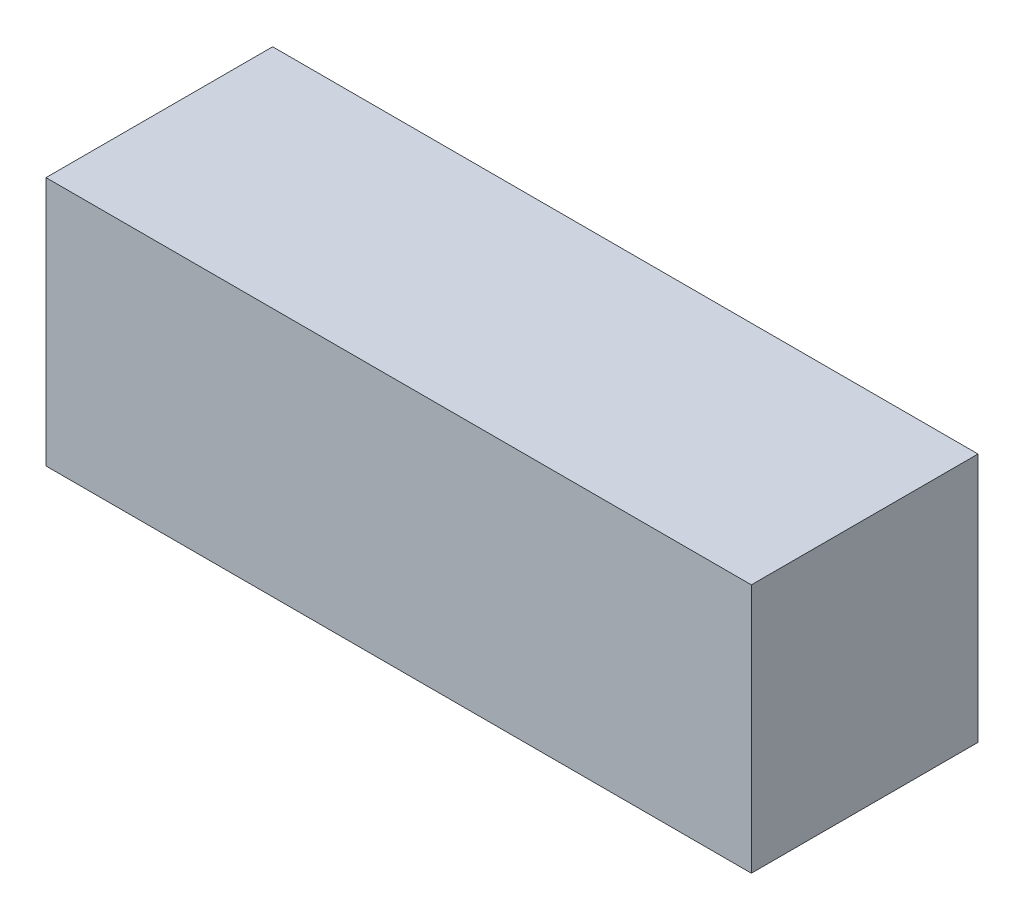
ISO-10303-21;
HEADER;
FILE_DESCRIPTION(('STEP AP214'),'2;1');
FILE_NAME('part.step','',(''),(''),'','','');
FILE_SCHEMA(('AUTOMOTIVE_DESIGN { 1 0 10303 214 1 1 1 1 }'));
ENDSEC;
DATA;
#1=APPLICATION_CONTEXT('core data for automotive mechanical design processes');
#2=APPLICATION_PROTOCOL_DEFINITION('international standard','automotive_design',2000,#1);
#3=PRODUCT_CONTEXT('',#1,'mechanical');
#4=PRODUCT('Part','Part','',(#3));
#5=PRODUCT_RELATED_PRODUCT_CATEGORY('part','',(#4));
#6=PRODUCT_DEFINITION_FORMATION('','',#4);
#7=PRODUCT_DEFINITION_CONTEXT('part definition',#1,'design');
#8=PRODUCT_DEFINITION('design','',#6,#7);
#9=PRODUCT_DEFINITION_SHAPE('','',#8);
#10=(LENGTH_UNIT() NAMED_UNIT(*) SI_UNIT(.MILLI.,.METRE.));
#11=(NAMED_UNIT(*) PLANE_ANGLE_UNIT() SI_UNIT($,.RADIAN.));
#12=(NAMED_UNIT(*) SI_UNIT($,.STERADIAN.) SOLID_ANGLE_UNIT());
#13=UNCERTAINTY_MEASURE_WITH_UNIT(LENGTH_MEASURE(1.E-05),#10,'distance_accuracy_value','');
#14=(GEOMETRIC_REPRESENTATION_CONTEXT(3) GLOBAL_UNCERTAINTY_ASSIGNED_CONTEXT((#13)) GLOBAL_UNIT_ASSIGNED_CONTEXT((#10,
#11,#12)) REPRESENTATION_CONTEXT('',''));
#15=CARTESIAN_POINT('',(0.,0.,0.));
#16=DIRECTION('',(0.,0.,1.));
#17=DIRECTION('',(1.,0.,0.));
#18=AXIS2_PLACEMENT_3D('',#15,#16,#17);
#19=CARTESIAN_POINT('',(0.,54.864,0.));
#20=DIRECTION('',(1.,0.,0.));
#21=DIRECTION('',(0.,0.,-1.));
#22=AXIS2_PLACEMENT_3D('',#19,#20,#21);
#23=PLANE('',#22);
#24=DIRECTION('',(0.,0.,1.));
#25=VECTOR('',#24,1.);
#26=CARTESIAN_POINT('',(0.,0.,0.));
#27=LINE('',#26,#25);
#28=CARTESIAN_POINT('',(0.,0.,-49.784));
#29=VERTEX_POINT('',#28);
#30=CARTESIAN_POINT('',(0.,0.,0.));
#31=VERTEX_POINT('',#30);
#32=EDGE_CURVE('E100',#29,#31,#27,.T.);
#33=ORIENTED_EDGE('',*,*,#32,.T.);
#34=DIRECTION('',(0.,-1.,0.));
#35=VECTOR('',#34,1.);
#36=CARTESIAN_POINT('',(0.,54.864,0.));
#37=LINE('',#36,#35);
#38=CARTESIAN_POINT('',(0.,54.864,0.));
#39=VERTEX_POINT('',#38);
#40=EDGE_CURVE('E11',#39,#31,#37,.T.);
#41=ORIENTED_EDGE('',*,*,#40,.F.);
#42=DIRECTION('',(0.,0.,1.));
#43=VECTOR('',#42,1.);
#44=CARTESIAN_POINT('',(0.,54.864,0.));
#45=LINE('',#44,#43);
#46=CARTESIAN_POINT('',(0.,54.864,-49.784));
#47=VERTEX_POINT('',#46);
#48=EDGE_CURVE('E88',#47,#39,#45,.T.);
#49=ORIENTED_EDGE('',*,*,#48,.F.);
#50=DIRECTION('',(0.,-1.,0.));
#51=VECTOR('',#50,1.);
#52=CARTESIAN_POINT('',(0.,54.864,-49.784));
#53=LINE('',#52,#51);
#54=EDGE_CURVE('E96',#47,#29,#53,.T.);
#55=ORIENTED_EDGE('',*,*,#54,.T.);
#56=EDGE_LOOP('',(#33,#41,#49,#55));
#57=FACE_BOUND('',#56,.T.);
#58=ADVANCED_FACE('F37',(#57),#23,.F.);
#59=CARTESIAN_POINT('',(0.,54.864,0.));
#60=DIRECTION('',(0.,0.,-1.));
#61=DIRECTION('',(-1.,0.,0.));
#62=AXIS2_PLACEMENT_3D('',#59,#60,#61);
#63=PLANE('',#62);
#64=DIRECTION('',(1.,0.,0.));
#65=VECTOR('',#64,1.);
#66=CARTESIAN_POINT('',(0.,0.,0.));
#67=LINE('',#66,#65);
#68=CARTESIAN_POINT('',(154.94,0.,0.));
#69=VERTEX_POINT('',#68);
#70=EDGE_CURVE('E92',#31,#69,#67,.T.);
#71=ORIENTED_EDGE('',*,*,#70,.T.);
#72=DIRECTION('',(0.,-1.,0.));
#73=VECTOR('',#72,1.);
#74=CARTESIAN_POINT('',(154.94,54.864,0.));
#75=LINE('',#74,#73);
#76=CARTESIAN_POINT('',(154.94,54.864,0.));
#77=VERTEX_POINT('',#76);
#78=EDGE_CURVE('E45',#77,#69,#75,.T.);
#79=ORIENTED_EDGE('',*,*,#78,.F.);
#80=DIRECTION('',(1.,0.,0.));
#81=VECTOR('',#80,1.);
#82=CARTESIAN_POINT('',(0.,54.864,0.));
#83=LINE('',#82,#81);
#84=EDGE_CURVE('E83',#39,#77,#83,.T.);
#85=ORIENTED_EDGE('',*,*,#84,.F.);
#86=ORIENTED_EDGE('',*,*,#40,.T.);
#87=EDGE_LOOP('',(#71,#79,#85,#86));
#88=FACE_BOUND('',#87,.T.);
#89=ADVANCED_FACE('F91',(#88),#63,.F.);
#90=CARTESIAN_POINT('',(154.94,54.864,0.));
#91=DIRECTION('',(-1.,0.,0.));
#92=DIRECTION('',(0.,0.,1.));
#93=AXIS2_PLACEMENT_3D('',#90,#91,#92);
#94=PLANE('',#93);
#95=DIRECTION('',(0.,0.,-1.));
#96=VECTOR('',#95,1.);
#97=CARTESIAN_POINT('',(154.94,0.,0.));
#98=LINE('',#97,#96);
#99=CARTESIAN_POINT('',(154.94,0.,-49.784));
#100=VERTEX_POINT('',#99);
#101=EDGE_CURVE('E70',#69,#100,#98,.T.);
#102=ORIENTED_EDGE('',*,*,#101,.T.);
#103=DIRECTION('',(0.,-1.,0.));
#104=VECTOR('',#103,1.);
#105=CARTESIAN_POINT('',(154.94,54.864,-49.784));
#106=LINE('',#105,#104);
#107=CARTESIAN_POINT('',(154.94,54.864,-49.784));
#108=VERTEX_POINT('',#107);
#109=EDGE_CURVE('E93',#108,#100,#106,.T.);
#110=ORIENTED_EDGE('',*,*,#109,.F.);
#111=DIRECTION('',(0.,0.,-1.));
#112=VECTOR('',#111,1.);
#113=CARTESIAN_POINT('',(154.94,54.864,0.));
#114=LINE('',#113,#112);
#115=EDGE_CURVE('E86',#77,#108,#114,.T.);
#116=ORIENTED_EDGE('',*,*,#115,.F.);
#117=ORIENTED_EDGE('',*,*,#78,.T.);
#118=EDGE_LOOP('',(#102,#110,#116,#117));
#119=FACE_BOUND('',#118,.T.);
#120=ADVANCED_FACE('F94',(#119),#94,.F.);
#121=CARTESIAN_POINT('',(0.,54.864,-49.784));
#122=DIRECTION('',(0.,0.,1.));
#123=DIRECTION('',(1.,0.,0.));
#124=AXIS2_PLACEMENT_3D('',#121,#122,#123);
#125=PLANE('',#124);
#126=DIRECTION('',(-1.,0.,0.));
#127=VECTOR('',#126,1.);
#128=CARTESIAN_POINT('',(0.,0.,-49.784));
#129=LINE('',#128,#127);
#130=EDGE_CURVE('E76',#100,#29,#129,.T.);
#131=ORIENTED_EDGE('',*,*,#130,.T.);
#132=ORIENTED_EDGE('',*,*,#54,.F.);
#133=DIRECTION('',(-1.,0.,0.));
#134=VECTOR('',#133,1.);
#135=CARTESIAN_POINT('',(0.,54.864,-49.784));
#136=LINE('',#135,#134);
#137=EDGE_CURVE('E53',#108,#47,#136,.T.);
#138=ORIENTED_EDGE('',*,*,#137,.F.);
#139=ORIENTED_EDGE('',*,*,#109,.T.);
#140=EDGE_LOOP('',(#131,#132,#138,#139));
#141=FACE_BOUND('',#140,.T.);
#142=ADVANCED_FACE('F107',(#141),#125,.F.);
#143=CARTESIAN_POINT('',(0.,54.864,0.));
#144=DIRECTION('',(0.,-1.,0.));
#145=DIRECTION('',(0.,0.,-1.));
#146=AXIS2_PLACEMENT_3D('',#143,#144,#145);
#147=PLANE('',#146);
#148=ORIENTED_EDGE('',*,*,#48,.T.);
#149=ORIENTED_EDGE('',*,*,#84,.T.);
#150=ORIENTED_EDGE('',*,*,#115,.T.);
#151=ORIENTED_EDGE('',*,*,#137,.T.);
#152=EDGE_LOOP('',(#148,#149,#150,#151));
#153=FACE_BOUND('',#152,.T.);
#154=ADVANCED_FACE('F84',(#153),#147,.F.);
#155=CARTESIAN_POINT('',(0.,0.,0.));
#156=DIRECTION('',(0.,-1.,0.));
#157=DIRECTION('',(0.,0.,-1.));
#158=AXIS2_PLACEMENT_3D('',#155,#156,#157);
#159=PLANE('',#158);
#160=ORIENTED_EDGE('',*,*,#32,.F.);
#161=ORIENTED_EDGE('',*,*,#130,.F.);
#162=ORIENTED_EDGE('',*,*,#101,.F.);
#163=ORIENTED_EDGE('',*,*,#70,.F.);
#164=EDGE_LOOP('',(#160,#161,#162,#163));
#165=FACE_BOUND('',#164,.T.);
#166=ADVANCED_FACE('F110',(#165),#159,.T.);
#167=CLOSED_SHELL('',(#58,#89,#120,#142,#154,#166));
#168=MANIFOLD_SOLID_BREP('B2',#167);
#169=ADVANCED_BREP_SHAPE_REPRESENTATION('',(#18,#168),#14);
#170=SHAPE_DEFINITION_REPRESENTATION(#9,#169);
ENDSEC;
END-ISO-10303-21;
